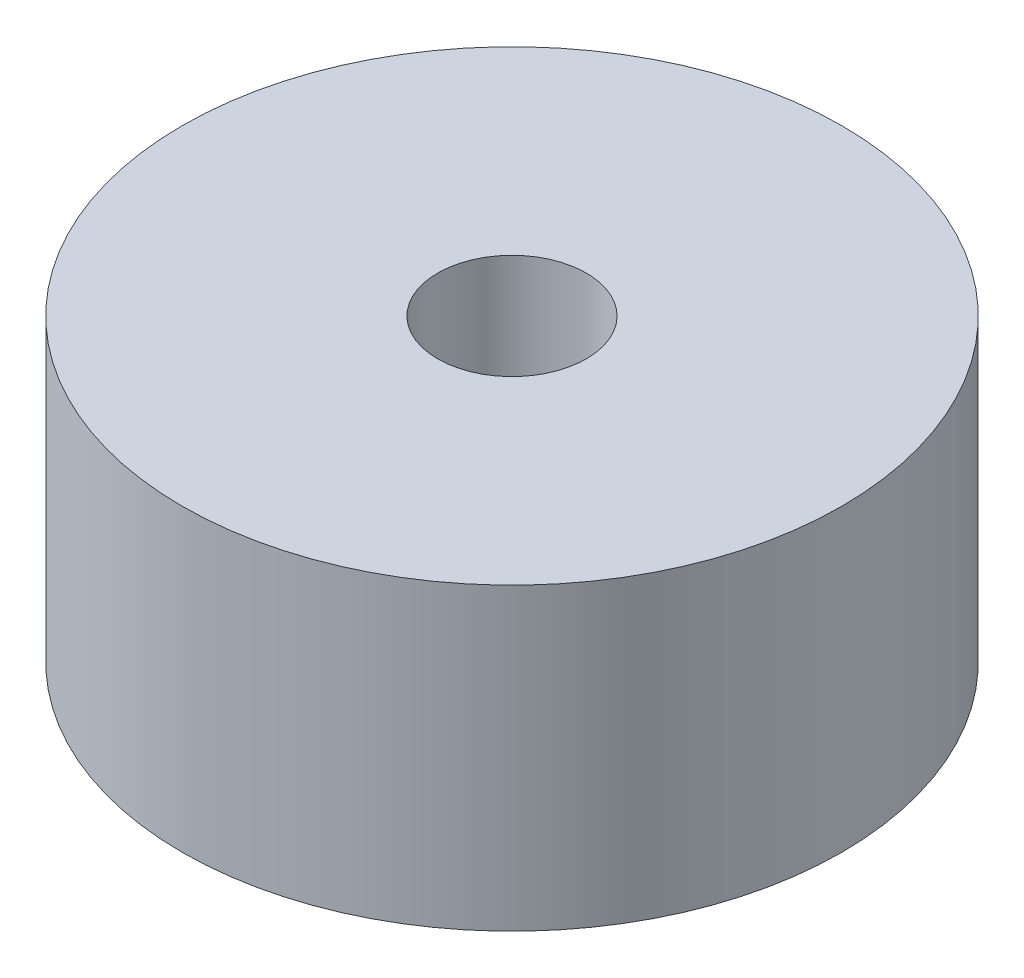
ISO-10303-21;
HEADER;
FILE_DESCRIPTION(('STEP AP214'),'2;1');
FILE_NAME('part.step','',(''),(''),'','','');
FILE_SCHEMA(('AUTOMOTIVE_DESIGN { 1 0 10303 214 1 1 1 1 }'));
ENDSEC;
DATA;
#1=APPLICATION_CONTEXT('core data for automotive mechanical design processes');
#2=APPLICATION_PROTOCOL_DEFINITION('international standard','automotive_design',2000,#1);
#3=PRODUCT_CONTEXT('',#1,'mechanical');
#4=PRODUCT('Part','Part','',(#3));
#5=PRODUCT_RELATED_PRODUCT_CATEGORY('part','',(#4));
#6=PRODUCT_DEFINITION_FORMATION('','',#4);
#7=PRODUCT_DEFINITION_CONTEXT('part definition',#1,'design');
#8=PRODUCT_DEFINITION('design','',#6,#7);
#9=PRODUCT_DEFINITION_SHAPE('','',#8);
#10=(LENGTH_UNIT() NAMED_UNIT(*) SI_UNIT(.MILLI.,.METRE.));
#11=(NAMED_UNIT(*) PLANE_ANGLE_UNIT() SI_UNIT($,.RADIAN.));
#12=(NAMED_UNIT(*) SI_UNIT($,.STERADIAN.) SOLID_ANGLE_UNIT());
#13=UNCERTAINTY_MEASURE_WITH_UNIT(LENGTH_MEASURE(1.E-05),#10,'distance_accuracy_value','');
#14=(GEOMETRIC_REPRESENTATION_CONTEXT(3) GLOBAL_UNCERTAINTY_ASSIGNED_CONTEXT((#13)) GLOBAL_UNIT_ASSIGNED_CONTEXT((#10,
#11,#12)) REPRESENTATION_CONTEXT('',''));
#15=CARTESIAN_POINT('',(0.,0.,0.));
#16=DIRECTION('',(0.,0.,1.));
#17=DIRECTION('',(1.,0.,0.));
#18=AXIS2_PLACEMENT_3D('',#15,#16,#17);
#19=CARTESIAN_POINT('',(0.,5.,0.));
#20=DIRECTION('',(0.,1.,0.));
#21=DIRECTION('',(0.,0.,1.));
#22=AXIS2_PLACEMENT_3D('',#19,#20,#21);
#23=PLANE('',#22);
#24=CARTESIAN_POINT('',(0.,5.,0.));
#25=DIRECTION('',(0.,1.,0.));
#26=DIRECTION('',(0.,0.,1.));
#27=AXIS2_PLACEMENT_3D('',#24,#25,#26);
#28=CIRCLE('',#27,5.5);
#29=CARTESIAN_POINT('',(0.,5.,5.5));
#30=VERTEX_POINT('',#29);
#31=EDGE_CURVE('E10',#30,#30,#28,.T.);
#32=ORIENTED_EDGE('',*,*,#31,.T.);
#33=EDGE_LOOP('',(#32));
#34=FACE_BOUND('',#33,.T.);
#35=CARTESIAN_POINT('',(0.,5.,0.));
#36=DIRECTION('',(0.,1.,0.));
#37=DIRECTION('',(0.,0.,1.));
#38=AXIS2_PLACEMENT_3D('',#35,#36,#37);
#39=CIRCLE('',#38,1.24);
#40=CARTESIAN_POINT('',(0.,5.,1.24));
#41=VERTEX_POINT('',#40);
#42=EDGE_CURVE('E42',#41,#41,#39,.T.);
#43=ORIENTED_EDGE('',*,*,#42,.F.);
#44=EDGE_LOOP('',(#43));
#45=FACE_BOUND('',#44,.T.);
#46=ADVANCED_FACE('F31',(#34,#45),#23,.T.);
#47=CARTESIAN_POINT('',(0.,0.,0.));
#48=DIRECTION('',(0.,1.,0.));
#49=DIRECTION('',(0.,0.,1.));
#50=AXIS2_PLACEMENT_3D('',#47,#48,#49);
#51=PLANE('',#50);
#52=CARTESIAN_POINT('',(0.,0.,0.));
#53=DIRECTION('',(0.,1.,0.));
#54=DIRECTION('',(0.,0.,1.));
#55=AXIS2_PLACEMENT_3D('',#52,#53,#54);
#56=CIRCLE('',#55,5.5);
#57=CARTESIAN_POINT('',(0.,0.,5.5));
#58=VERTEX_POINT('',#57);
#59=EDGE_CURVE('E35',#58,#58,#56,.T.);
#60=ORIENTED_EDGE('',*,*,#59,.F.);
#61=EDGE_LOOP('',(#60));
#62=FACE_BOUND('',#61,.T.);
#63=CARTESIAN_POINT('',(0.,0.,0.));
#64=DIRECTION('',(0.,1.,0.));
#65=DIRECTION('',(0.,0.,1.));
#66=AXIS2_PLACEMENT_3D('',#63,#64,#65);
#67=CIRCLE('',#66,1.24);
#68=CARTESIAN_POINT('',(0.,0.,1.24));
#69=VERTEX_POINT('',#68);
#70=EDGE_CURVE('E44',#69,#69,#67,.T.);
#71=ORIENTED_EDGE('',*,*,#70,.T.);
#72=EDGE_LOOP('',(#71));
#73=FACE_BOUND('',#72,.T.);
#74=ADVANCED_FACE('F54',(#62,#73),#51,.F.);
#75=CARTESIAN_POINT('',(0.,5.,0.));
#76=DIRECTION('',(0.,-1.,0.));
#77=DIRECTION('',(0.,0.,-1.));
#78=AXIS2_PLACEMENT_3D('',#75,#76,#77);
#79=CYLINDRICAL_SURFACE('',#78,5.5);
#80=ORIENTED_EDGE('',*,*,#31,.F.);
#81=EDGE_LOOP('',(#80));
#82=FACE_BOUND('',#81,.T.);
#83=ORIENTED_EDGE('',*,*,#59,.T.);
#84=EDGE_LOOP('',(#83));
#85=FACE_BOUND('',#84,.T.);
#86=ADVANCED_FACE('F33',(#82,#85),#79,.T.);
#87=CARTESIAN_POINT('',(0.,5.,0.));
#88=DIRECTION('',(0.,-1.,0.));
#89=DIRECTION('',(0.,0.,-1.));
#90=AXIS2_PLACEMENT_3D('',#87,#88,#89);
#91=CYLINDRICAL_SURFACE('',#90,1.24);
#92=ORIENTED_EDGE('',*,*,#42,.T.);
#93=EDGE_LOOP('',(#92));
#94=FACE_BOUND('',#93,.T.);
#95=ORIENTED_EDGE('',*,*,#70,.F.);
#96=EDGE_LOOP('',(#95));
#97=FACE_BOUND('',#96,.T.);
#98=ADVANCED_FACE('F50',(#94,#97),#91,.F.);
#99=CLOSED_SHELL('',(#46,#74,#86,#98));
#100=MANIFOLD_SOLID_BREP('B2',#99);
#101=ADVANCED_BREP_SHAPE_REPRESENTATION('',(#18,#100),#14);
#102=SHAPE_DEFINITION_REPRESENTATION(#9,#101);
ENDSEC;
END-ISO-10303-21;
